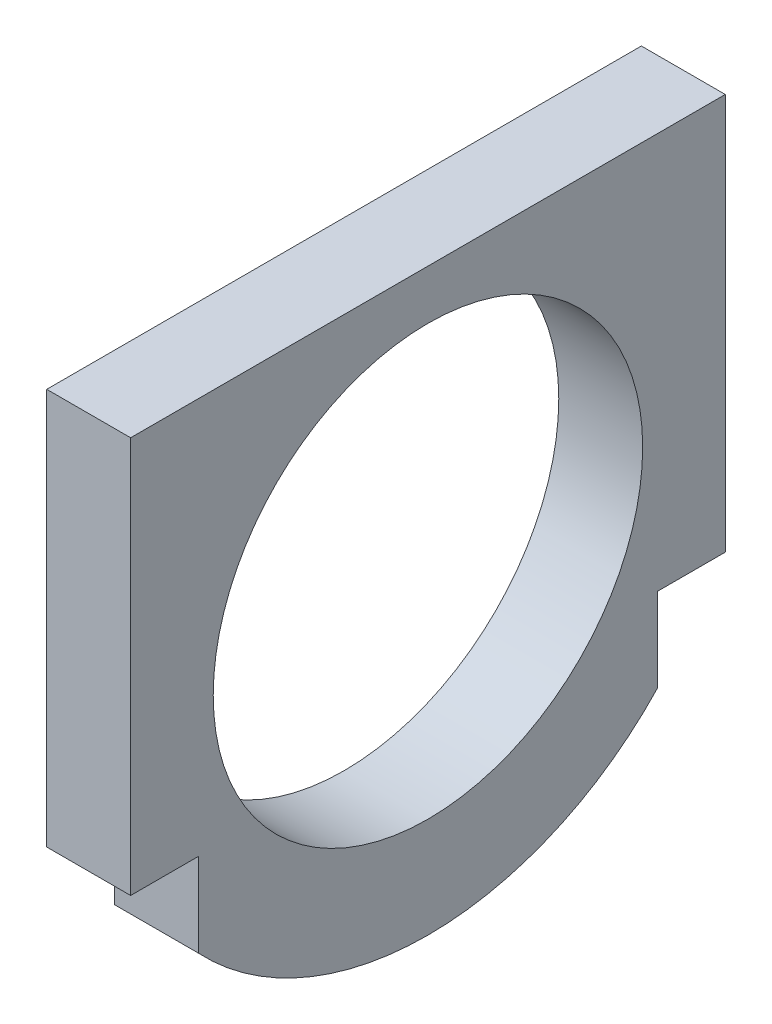
ISO-10303-21;
HEADER;
FILE_DESCRIPTION(('STEP AP214'),'2;1');
FILE_NAME('part.step','',(''),(''),'','','');
FILE_SCHEMA(('AUTOMOTIVE_DESIGN { 1 0 10303 214 1 1 1 1 }'));
ENDSEC;
DATA;
#1=APPLICATION_CONTEXT('core data for automotive mechanical design processes');
#2=APPLICATION_PROTOCOL_DEFINITION('international standard','automotive_design',2000,#1);
#3=PRODUCT_CONTEXT('',#1,'mechanical');
#4=PRODUCT('Part','Part','',(#3));
#5=PRODUCT_RELATED_PRODUCT_CATEGORY('part','',(#4));
#6=PRODUCT_DEFINITION_FORMATION('','',#4);
#7=PRODUCT_DEFINITION_CONTEXT('part definition',#1,'design');
#8=PRODUCT_DEFINITION('design','',#6,#7);
#9=PRODUCT_DEFINITION_SHAPE('','',#8);
#10=(LENGTH_UNIT() NAMED_UNIT(*) SI_UNIT(.MILLI.,.METRE.));
#11=(NAMED_UNIT(*) PLANE_ANGLE_UNIT() SI_UNIT($,.RADIAN.));
#12=(NAMED_UNIT(*) SI_UNIT($,.STERADIAN.) SOLID_ANGLE_UNIT());
#13=UNCERTAINTY_MEASURE_WITH_UNIT(LENGTH_MEASURE(1.E-05),#10,'distance_accuracy_value','');
#14=(GEOMETRIC_REPRESENTATION_CONTEXT(3) GLOBAL_UNCERTAINTY_ASSIGNED_CONTEXT((#13)) GLOBAL_UNIT_ASSIGNED_CONTEXT((#10,
#11,#12)) REPRESENTATION_CONTEXT('',''));
#15=CARTESIAN_POINT('',(0.,0.,0.));
#16=DIRECTION('',(0.,0.,1.));
#17=DIRECTION('',(1.,0.,0.));
#18=AXIS2_PLACEMENT_3D('',#15,#16,#17);
#19=CARTESIAN_POINT('',(2.54,0.,0.));
#20=DIRECTION('',(1.,0.,0.));
#21=DIRECTION('',(0.,0.,-1.));
#22=AXIS2_PLACEMENT_3D('',#19,#20,#21);
#23=PLANE('',#22);
#24=DIRECTION('',(0.,0.,1.));
#25=VECTOR('',#24,1.);
#26=CARTESIAN_POINT('',(2.54,8.,-9.));
#27=LINE('',#26,#25);
#28=CARTESIAN_POINT('',(2.54,8.,-9.));
#29=VERTEX_POINT('',#28);
#30=CARTESIAN_POINT('',(2.54,8.,9.));
#31=VERTEX_POINT('',#30);
#32=EDGE_CURVE('E145',#29,#31,#27,.T.);
#33=ORIENTED_EDGE('',*,*,#32,.T.);
#34=DIRECTION('',(0.,-1.,0.));
#35=VECTOR('',#34,1.);
#36=CARTESIAN_POINT('',(2.54,8.,9.));
#37=LINE('',#36,#35);
#38=CARTESIAN_POINT('',(2.54,-4.,9.));
#39=VERTEX_POINT('',#38);
#40=EDGE_CURVE('E93',#31,#39,#37,.T.);
#41=ORIENTED_EDGE('',*,*,#40,.T.);
#42=DIRECTION('',(0.,0.,-1.));
#43=VECTOR('',#42,1.);
#44=CARTESIAN_POINT('',(2.54,-4.,9.));
#45=LINE('',#44,#43);
#46=CARTESIAN_POINT('',(2.54,-4.,6.94550214167413));
#47=VERTEX_POINT('',#46);
#48=EDGE_CURVE('E160',#39,#47,#45,.T.);
#49=ORIENTED_EDGE('',*,*,#48,.T.);
#50=DIRECTION('',(0.,-1.,0.));
#51=VECTOR('',#50,1.);
#52=CARTESIAN_POINT('',(2.54,-6.54,6.94550214167413));
#53=LINE('',#52,#51);
#54=CARTESIAN_POINT('',(2.54,-6.54,6.94550214167414));
#55=VERTEX_POINT('',#54);
#56=EDGE_CURVE('E173',#47,#55,#53,.T.);
#57=ORIENTED_EDGE('',*,*,#56,.T.);
#58=CARTESIAN_POINT('',(2.54,0.,0.));
#59=DIRECTION('',(1.,0.,0.));
#60=DIRECTION('',(0.,0.,-1.));
#61=AXIS2_PLACEMENT_3D('',#58,#59,#60);
#62=CIRCLE('',#61,9.54);
#63=CARTESIAN_POINT('',(2.54,-6.54,-6.94550214167413));
#64=VERTEX_POINT('',#63);
#65=EDGE_CURVE('E112',#55,#64,#62,.T.);
#66=ORIENTED_EDGE('',*,*,#65,.T.);
#67=DIRECTION('',(0.,1.,0.));
#68=VECTOR('',#67,1.);
#69=CARTESIAN_POINT('',(2.54,-6.54,-6.94550214167413));
#70=LINE('',#69,#68);
#71=CARTESIAN_POINT('',(2.54,-4.,-6.94550214167413));
#72=VERTEX_POINT('',#71);
#73=EDGE_CURVE('E106',#64,#72,#70,.T.);
#74=ORIENTED_EDGE('',*,*,#73,.T.);
#75=DIRECTION('',(0.,0.,-1.));
#76=VECTOR('',#75,1.);
#77=CARTESIAN_POINT('',(2.54,-4.,-6.94550214167413));
#78=LINE('',#77,#76);
#79=CARTESIAN_POINT('',(2.54,-4.,-9.));
#80=VERTEX_POINT('',#79);
#81=EDGE_CURVE('E110',#72,#80,#78,.T.);
#82=ORIENTED_EDGE('',*,*,#81,.T.);
#83=DIRECTION('',(0.,1.,0.));
#84=VECTOR('',#83,1.);
#85=CARTESIAN_POINT('',(2.54,-4.,-9.));
#86=LINE('',#85,#84);
#87=EDGE_CURVE('E50',#80,#29,#86,.T.);
#88=ORIENTED_EDGE('',*,*,#87,.T.);
#89=EDGE_LOOP('',(#33,#41,#49,#57,#66,#74,#82,#88));
#90=FACE_BOUND('',#89,.T.);
#91=CARTESIAN_POINT('',(2.54,0.,0.));
#92=DIRECTION('',(1.,0.,0.));
#93=DIRECTION('',(0.,0.,-1.));
#94=AXIS2_PLACEMENT_3D('',#91,#92,#93);
#95=CIRCLE('',#94,6.5);
#96=CARTESIAN_POINT('',(2.54,0.,-6.5));
#97=VERTEX_POINT('',#96);
#98=EDGE_CURVE('E134',#97,#97,#95,.T.);
#99=ORIENTED_EDGE('',*,*,#98,.F.);
#100=EDGE_LOOP('',(#99));
#101=FACE_BOUND('',#100,.T.);
#102=ADVANCED_FACE('F33',(#90,#101),#23,.T.);
#103=CARTESIAN_POINT('',(0.,0.,0.));
#104=DIRECTION('',(1.,0.,0.));
#105=DIRECTION('',(0.,0.,-1.));
#106=AXIS2_PLACEMENT_3D('',#103,#104,#105);
#107=PLANE('',#106);
#108=DIRECTION('',(0.,0.,1.));
#109=VECTOR('',#108,1.);
#110=CARTESIAN_POINT('',(0.,8.,-9.));
#111=LINE('',#110,#109);
#112=CARTESIAN_POINT('',(0.,8.,-9.));
#113=VERTEX_POINT('',#112);
#114=CARTESIAN_POINT('',(0.,8.,9.));
#115=VERTEX_POINT('',#114);
#116=EDGE_CURVE('E130',#113,#115,#111,.T.);
#117=ORIENTED_EDGE('',*,*,#116,.F.);
#118=DIRECTION('',(0.,1.,0.));
#119=VECTOR('',#118,1.);
#120=CARTESIAN_POINT('',(0.,-4.,-9.));
#121=LINE('',#120,#119);
#122=CARTESIAN_POINT('',(0.,-4.,-9.));
#123=VERTEX_POINT('',#122);
#124=EDGE_CURVE('E85',#123,#113,#121,.T.);
#125=ORIENTED_EDGE('',*,*,#124,.F.);
#126=DIRECTION('',(0.,0.,-1.));
#127=VECTOR('',#126,1.);
#128=CARTESIAN_POINT('',(0.,-4.,-6.94550214167413));
#129=LINE('',#128,#127);
#130=CARTESIAN_POINT('',(0.,-4.,-6.94550214167413));
#131=VERTEX_POINT('',#130);
#132=EDGE_CURVE('E79',#131,#123,#129,.T.);
#133=ORIENTED_EDGE('',*,*,#132,.F.);
#134=DIRECTION('',(0.,1.,0.));
#135=VECTOR('',#134,1.);
#136=CARTESIAN_POINT('',(0.,-6.54,-6.94550214167413));
#137=LINE('',#136,#135);
#138=CARTESIAN_POINT('',(0.,-6.54,-6.94550214167413));
#139=VERTEX_POINT('',#138);
#140=EDGE_CURVE('E120',#139,#131,#137,.T.);
#141=ORIENTED_EDGE('',*,*,#140,.F.);
#142=CARTESIAN_POINT('',(0.,0.,0.));
#143=DIRECTION('',(1.,0.,0.));
#144=DIRECTION('',(0.,0.,-1.));
#145=AXIS2_PLACEMENT_3D('',#142,#143,#144);
#146=CIRCLE('',#145,9.54);
#147=CARTESIAN_POINT('',(0.,-6.54,6.94550214167414));
#148=VERTEX_POINT('',#147);
#149=EDGE_CURVE('E140',#148,#139,#146,.T.);
#150=ORIENTED_EDGE('',*,*,#149,.F.);
#151=DIRECTION('',(0.,-1.,0.));
#152=VECTOR('',#151,1.);
#153=CARTESIAN_POINT('',(0.,-6.54,6.94550214167413));
#154=LINE('',#153,#152);
#155=CARTESIAN_POINT('',(0.,-4.,6.94550214167413));
#156=VERTEX_POINT('',#155);
#157=EDGE_CURVE('E138',#156,#148,#154,.T.);
#158=ORIENTED_EDGE('',*,*,#157,.F.);
#159=DIRECTION('',(0.,0.,-1.));
#160=VECTOR('',#159,1.);
#161=CARTESIAN_POINT('',(0.,-4.,9.));
#162=LINE('',#161,#160);
#163=CARTESIAN_POINT('',(0.,-4.,9.));
#164=VERTEX_POINT('',#163);
#165=EDGE_CURVE('E136',#164,#156,#162,.T.);
#166=ORIENTED_EDGE('',*,*,#165,.F.);
#167=DIRECTION('',(0.,-1.,0.));
#168=VECTOR('',#167,1.);
#169=CARTESIAN_POINT('',(0.,8.,9.));
#170=LINE('',#169,#168);
#171=EDGE_CURVE('E133',#115,#164,#170,.T.);
#172=ORIENTED_EDGE('',*,*,#171,.F.);
#173=EDGE_LOOP('',(#117,#125,#133,#141,#150,#158,#166,#172));
#174=FACE_BOUND('',#173,.T.);
#175=CARTESIAN_POINT('',(0.,0.,0.));
#176=DIRECTION('',(1.,0.,0.));
#177=DIRECTION('',(0.,0.,-1.));
#178=AXIS2_PLACEMENT_3D('',#175,#176,#177);
#179=CIRCLE('',#178,6.5);
#180=CARTESIAN_POINT('',(0.,0.,-6.5));
#181=VERTEX_POINT('',#180);
#182=EDGE_CURVE('E179',#181,#181,#179,.T.);
#183=ORIENTED_EDGE('',*,*,#182,.T.);
#184=EDGE_LOOP('',(#183));
#185=FACE_BOUND('',#184,.T.);
#186=ADVANCED_FACE('F164',(#174,#185),#107,.F.);
#187=CARTESIAN_POINT('',(2.54,8.,-9.));
#188=DIRECTION('',(0.,-1.,0.));
#189=DIRECTION('',(0.,0.,-1.));
#190=AXIS2_PLACEMENT_3D('',#187,#188,#189);
#191=PLANE('',#190);
#192=ORIENTED_EDGE('',*,*,#116,.T.);
#193=DIRECTION('',(-1.,0.,0.));
#194=VECTOR('',#193,1.);
#195=CARTESIAN_POINT('',(2.54,8.,9.));
#196=LINE('',#195,#194);
#197=EDGE_CURVE('E11',#31,#115,#196,.T.);
#198=ORIENTED_EDGE('',*,*,#197,.F.);
#199=ORIENTED_EDGE('',*,*,#32,.F.);
#200=DIRECTION('',(-1.,0.,0.));
#201=VECTOR('',#200,1.);
#202=CARTESIAN_POINT('',(2.54,8.,-9.));
#203=LINE('',#202,#201);
#204=EDGE_CURVE('E126',#29,#113,#203,.T.);
#205=ORIENTED_EDGE('',*,*,#204,.T.);
#206=EDGE_LOOP('',(#192,#198,#199,#205));
#207=FACE_BOUND('',#206,.T.);
#208=ADVANCED_FACE('F35',(#207),#191,.F.);
#209=CARTESIAN_POINT('',(2.54,8.,9.));
#210=DIRECTION('',(0.,0.,-1.));
#211=DIRECTION('',(0.,1.,0.));
#212=AXIS2_PLACEMENT_3D('',#209,#210,#211);
#213=PLANE('',#212);
#214=ORIENTED_EDGE('',*,*,#171,.T.);
#215=DIRECTION('',(-1.,0.,0.));
#216=VECTOR('',#215,1.);
#217=CARTESIAN_POINT('',(2.54,-4.,9.));
#218=LINE('',#217,#216);
#219=EDGE_CURVE('E42',#39,#164,#218,.T.);
#220=ORIENTED_EDGE('',*,*,#219,.F.);
#221=ORIENTED_EDGE('',*,*,#40,.F.);
#222=ORIENTED_EDGE('',*,*,#197,.T.);
#223=EDGE_LOOP('',(#214,#220,#221,#222));
#224=FACE_BOUND('',#223,.T.);
#225=ADVANCED_FACE('F207',(#224),#213,.F.);
#226=CARTESIAN_POINT('',(2.54,-4.,9.));
#227=DIRECTION('',(0.,1.,0.));
#228=DIRECTION('',(0.,0.,1.));
#229=AXIS2_PLACEMENT_3D('',#226,#227,#228);
#230=PLANE('',#229);
#231=ORIENTED_EDGE('',*,*,#165,.T.);
#232=DIRECTION('',(-1.,0.,0.));
#233=VECTOR('',#232,1.);
#234=CARTESIAN_POINT('',(2.54,-4.,6.94550214167413));
#235=LINE('',#234,#233);
#236=EDGE_CURVE('E152',#47,#156,#235,.T.);
#237=ORIENTED_EDGE('',*,*,#236,.F.);
#238=ORIENTED_EDGE('',*,*,#48,.F.);
#239=ORIENTED_EDGE('',*,*,#219,.T.);
#240=EDGE_LOOP('',(#231,#237,#238,#239));
#241=FACE_BOUND('',#240,.T.);
#242=ADVANCED_FACE('F158',(#241),#230,.F.);
#243=CARTESIAN_POINT('',(2.54,-6.54,6.94550214167413));
#244=DIRECTION('',(0.,0.,-1.));
#245=DIRECTION('',(-1.,0.,0.));
#246=AXIS2_PLACEMENT_3D('',#243,#244,#245);
#247=PLANE('',#246);
#248=ORIENTED_EDGE('',*,*,#157,.T.);
#249=DIRECTION('',(-1.,0.,0.));
#250=VECTOR('',#249,1.);
#251=CARTESIAN_POINT('',(2.54,-6.54,6.94550214167414));
#252=LINE('',#251,#250);
#253=EDGE_CURVE('E149',#55,#148,#252,.T.);
#254=ORIENTED_EDGE('',*,*,#253,.F.);
#255=ORIENTED_EDGE('',*,*,#56,.F.);
#256=ORIENTED_EDGE('',*,*,#236,.T.);
#257=EDGE_LOOP('',(#248,#254,#255,#256));
#258=FACE_BOUND('',#257,.T.);
#259=ADVANCED_FACE('F169',(#258),#247,.F.);
#260=CARTESIAN_POINT('',(2.54,0.,0.));
#261=DIRECTION('',(-1.,0.,0.));
#262=DIRECTION('',(0.,0.,1.));
#263=AXIS2_PLACEMENT_3D('',#260,#261,#262);
#264=CYLINDRICAL_SURFACE('',#263,9.54);
#265=ORIENTED_EDGE('',*,*,#149,.T.);
#266=DIRECTION('',(-1.,0.,0.));
#267=VECTOR('',#266,1.);
#268=CARTESIAN_POINT('',(2.54,-6.54,-6.94550214167413));
#269=LINE('',#268,#267);
#270=EDGE_CURVE('E121',#64,#139,#269,.T.);
#271=ORIENTED_EDGE('',*,*,#270,.F.);
#272=ORIENTED_EDGE('',*,*,#65,.F.);
#273=ORIENTED_EDGE('',*,*,#253,.T.);
#274=EDGE_LOOP('',(#265,#271,#272,#273));
#275=FACE_BOUND('',#274,.T.);
#276=ADVANCED_FACE('F172',(#275),#264,.T.);
#277=CARTESIAN_POINT('',(2.54,-6.54,-6.94550214167413));
#278=DIRECTION('',(0.,0.,1.));
#279=DIRECTION('',(1.,0.,0.));
#280=AXIS2_PLACEMENT_3D('',#277,#278,#279);
#281=PLANE('',#280);
#282=ORIENTED_EDGE('',*,*,#140,.T.);
#283=DIRECTION('',(-1.,0.,0.));
#284=VECTOR('',#283,1.);
#285=CARTESIAN_POINT('',(2.54,-4.,-6.94550214167413));
#286=LINE('',#285,#284);
#287=EDGE_CURVE('E117',#72,#131,#286,.T.);
#288=ORIENTED_EDGE('',*,*,#287,.F.);
#289=ORIENTED_EDGE('',*,*,#73,.F.);
#290=ORIENTED_EDGE('',*,*,#270,.T.);
#291=EDGE_LOOP('',(#282,#288,#289,#290));
#292=FACE_BOUND('',#291,.T.);
#293=ADVANCED_FACE('F118',(#292),#281,.F.);
#294=CARTESIAN_POINT('',(2.54,-4.,-6.94550214167413));
#295=DIRECTION('',(0.,1.,0.));
#296=DIRECTION('',(0.,0.,1.));
#297=AXIS2_PLACEMENT_3D('',#294,#295,#296);
#298=PLANE('',#297);
#299=ORIENTED_EDGE('',*,*,#132,.T.);
#300=DIRECTION('',(-1.,0.,0.));
#301=VECTOR('',#300,1.);
#302=CARTESIAN_POINT('',(2.54,-4.,-9.));
#303=LINE('',#302,#301);
#304=EDGE_CURVE('E122',#80,#123,#303,.T.);
#305=ORIENTED_EDGE('',*,*,#304,.F.);
#306=ORIENTED_EDGE('',*,*,#81,.F.);
#307=ORIENTED_EDGE('',*,*,#287,.T.);
#308=EDGE_LOOP('',(#299,#305,#306,#307));
#309=FACE_BOUND('',#308,.T.);
#310=ADVANCED_FACE('F124',(#309),#298,.F.);
#311=CARTESIAN_POINT('',(2.54,-4.,-9.));
#312=DIRECTION('',(0.,0.,1.));
#313=DIRECTION('',(1.,0.,0.));
#314=AXIS2_PLACEMENT_3D('',#311,#312,#313);
#315=PLANE('',#314);
#316=ORIENTED_EDGE('',*,*,#124,.T.);
#317=ORIENTED_EDGE('',*,*,#204,.F.);
#318=ORIENTED_EDGE('',*,*,#87,.F.);
#319=ORIENTED_EDGE('',*,*,#304,.T.);
#320=EDGE_LOOP('',(#316,#317,#318,#319));
#321=FACE_BOUND('',#320,.T.);
#322=ADVANCED_FACE('F195',(#321),#315,.F.);
#323=CARTESIAN_POINT('',(2.54,0.,0.));
#324=DIRECTION('',(-1.,0.,0.));
#325=DIRECTION('',(0.,0.,1.));
#326=AXIS2_PLACEMENT_3D('',#323,#324,#325);
#327=CYLINDRICAL_SURFACE('',#326,6.5);
#328=ORIENTED_EDGE('',*,*,#98,.T.);
#329=EDGE_LOOP('',(#328));
#330=FACE_BOUND('',#329,.T.);
#331=ORIENTED_EDGE('',*,*,#182,.F.);
#332=EDGE_LOOP('',(#331));
#333=FACE_BOUND('',#332,.T.);
#334=ADVANCED_FACE('F185',(#330,#333),#327,.F.);
#335=CLOSED_SHELL('',(#102,#186,#208,#225,#242,#259,#276,#293,#310,#322,#334));
#336=MANIFOLD_SOLID_BREP('B2',#335);
#337=ADVANCED_BREP_SHAPE_REPRESENTATION('',(#18,#336),#14);
#338=SHAPE_DEFINITION_REPRESENTATION(#9,#337);
ENDSEC;
END-ISO-10303-21;
